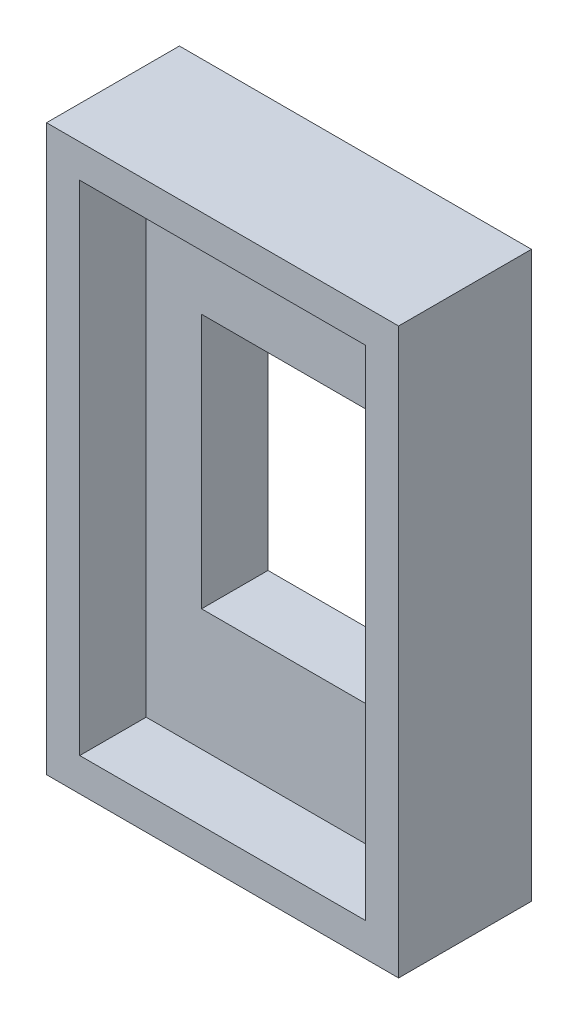
ISO-10303-21;
HEADER;
FILE_DESCRIPTION(('STEP AP214'),'2;1');
FILE_NAME('part.step','',(''),(''),'','','');
FILE_SCHEMA(('AUTOMOTIVE_DESIGN { 1 0 10303 214 1 1 1 1 }'));
ENDSEC;
DATA;
#1=APPLICATION_CONTEXT('core data for automotive mechanical design processes');
#2=APPLICATION_PROTOCOL_DEFINITION('international standard','automotive_design',2000,#1);
#3=PRODUCT_CONTEXT('',#1,'mechanical');
#4=PRODUCT('Part','Part','',(#3));
#5=PRODUCT_RELATED_PRODUCT_CATEGORY('part','',(#4));
#6=PRODUCT_DEFINITION_FORMATION('','',#4);
#7=PRODUCT_DEFINITION_CONTEXT('part definition',#1,'design');
#8=PRODUCT_DEFINITION('design','',#6,#7);
#9=PRODUCT_DEFINITION_SHAPE('','',#8);
#10=(LENGTH_UNIT() NAMED_UNIT(*) SI_UNIT(.MILLI.,.METRE.));
#11=(NAMED_UNIT(*) PLANE_ANGLE_UNIT() SI_UNIT($,.RADIAN.));
#12=(NAMED_UNIT(*) SI_UNIT($,.STERADIAN.) SOLID_ANGLE_UNIT());
#13=UNCERTAINTY_MEASURE_WITH_UNIT(LENGTH_MEASURE(1.E-05),#10,'distance_accuracy_value','');
#14=(GEOMETRIC_REPRESENTATION_CONTEXT(3) GLOBAL_UNCERTAINTY_ASSIGNED_CONTEXT((#13)) GLOBAL_UNIT_ASSIGNED_CONTEXT((#10,
#11,#12)) REPRESENTATION_CONTEXT('',''));
#15=CARTESIAN_POINT('',(0.,0.,0.));
#16=DIRECTION('',(0.,0.,1.));
#17=DIRECTION('',(1.,0.,0.));
#18=AXIS2_PLACEMENT_3D('',#15,#16,#17);
#19=CARTESIAN_POINT('',(-26.5,-42.5,20.));
#20=DIRECTION('',(1.,0.,0.));
#21=DIRECTION('',(0.,0.,-1.));
#22=AXIS2_PLACEMENT_3D('',#19,#20,#21);
#23=PLANE('',#22);
#24=DIRECTION('',(0.,-1.,0.));
#25=VECTOR('',#24,1.);
#26=CARTESIAN_POINT('',(-26.5,-42.5,0.));
#27=LINE('',#26,#25);
#28=CARTESIAN_POINT('',(-26.5,42.5,0.));
#29=VERTEX_POINT('',#28);
#30=CARTESIAN_POINT('',(-26.5,-42.5,0.));
#31=VERTEX_POINT('',#30);
#32=EDGE_CURVE('E183',#29,#31,#27,.T.);
#33=ORIENTED_EDGE('',*,*,#32,.T.);
#34=DIRECTION('',(0.,0.,-1.));
#35=VECTOR('',#34,1.);
#36=CARTESIAN_POINT('',(-26.5,-42.5,20.));
#37=LINE('',#36,#35);
#38=CARTESIAN_POINT('',(-26.5,-42.5,20.));
#39=VERTEX_POINT('',#38);
#40=EDGE_CURVE('E11',#39,#31,#37,.T.);
#41=ORIENTED_EDGE('',*,*,#40,.F.);
#42=DIRECTION('',(0.,-1.,0.));
#43=VECTOR('',#42,1.);
#44=CARTESIAN_POINT('',(-26.5,-42.5,20.));
#45=LINE('',#44,#43);
#46=CARTESIAN_POINT('',(-26.5,42.5,20.));
#47=VERTEX_POINT('',#46);
#48=EDGE_CURVE('E190',#47,#39,#45,.T.);
#49=ORIENTED_EDGE('',*,*,#48,.F.);
#50=DIRECTION('',(0.,0.,-1.));
#51=VECTOR('',#50,1.);
#52=CARTESIAN_POINT('',(-26.5,42.5,20.));
#53=LINE('',#52,#51);
#54=EDGE_CURVE('E200',#47,#29,#53,.T.);
#55=ORIENTED_EDGE('',*,*,#54,.T.);
#56=EDGE_LOOP('',(#33,#41,#49,#55));
#57=FACE_BOUND('',#56,.T.);
#58=ADVANCED_FACE('F33',(#57),#23,.F.);
#59=CARTESIAN_POINT('',(26.5,-42.5,20.));
#60=DIRECTION('',(0.,1.,0.));
#61=DIRECTION('',(-1.,0.,0.));
#62=AXIS2_PLACEMENT_3D('',#59,#60,#61);
#63=PLANE('',#62);
#64=DIRECTION('',(1.,0.,0.));
#65=VECTOR('',#64,1.);
#66=CARTESIAN_POINT('',(26.5,-42.5,0.));
#67=LINE('',#66,#65);
#68=CARTESIAN_POINT('',(26.5,-42.5,0.));
#69=VERTEX_POINT('',#68);
#70=EDGE_CURVE('E203',#31,#69,#67,.T.);
#71=ORIENTED_EDGE('',*,*,#70,.T.);
#72=DIRECTION('',(0.,0.,-1.));
#73=VECTOR('',#72,1.);
#74=CARTESIAN_POINT('',(26.5,-42.5,20.));
#75=LINE('',#74,#73);
#76=CARTESIAN_POINT('',(26.5,-42.5,20.));
#77=VERTEX_POINT('',#76);
#78=EDGE_CURVE('E40',#77,#69,#75,.T.);
#79=ORIENTED_EDGE('',*,*,#78,.F.);
#80=DIRECTION('',(1.,0.,0.));
#81=VECTOR('',#80,1.);
#82=CARTESIAN_POINT('',(26.5,-42.5,20.));
#83=LINE('',#82,#81);
#84=EDGE_CURVE('E193',#39,#77,#83,.T.);
#85=ORIENTED_EDGE('',*,*,#84,.F.);
#86=ORIENTED_EDGE('',*,*,#40,.T.);
#87=EDGE_LOOP('',(#71,#79,#85,#86));
#88=FACE_BOUND('',#87,.T.);
#89=ADVANCED_FACE('F233',(#88),#63,.F.);
#90=CARTESIAN_POINT('',(26.5,-42.5,20.));
#91=DIRECTION('',(-1.,0.,0.));
#92=DIRECTION('',(0.,0.,1.));
#93=AXIS2_PLACEMENT_3D('',#90,#91,#92);
#94=PLANE('',#93);
#95=DIRECTION('',(0.,1.,0.));
#96=VECTOR('',#95,1.);
#97=CARTESIAN_POINT('',(26.5,-42.5,0.));
#98=LINE('',#97,#96);
#99=CARTESIAN_POINT('',(26.5,42.5,0.));
#100=VERTEX_POINT('',#99);
#101=EDGE_CURVE('E205',#69,#100,#98,.T.);
#102=ORIENTED_EDGE('',*,*,#101,.T.);
#103=DIRECTION('',(0.,0.,-1.));
#104=VECTOR('',#103,1.);
#105=CARTESIAN_POINT('',(26.5,42.5,20.));
#106=LINE('',#105,#104);
#107=CARTESIAN_POINT('',(26.5,42.5,20.));
#108=VERTEX_POINT('',#107);
#109=EDGE_CURVE('E210',#108,#100,#106,.T.);
#110=ORIENTED_EDGE('',*,*,#109,.F.);
#111=DIRECTION('',(0.,1.,0.));
#112=VECTOR('',#111,1.);
#113=CARTESIAN_POINT('',(26.5,-42.5,20.));
#114=LINE('',#113,#112);
#115=EDGE_CURVE('E196',#77,#108,#114,.T.);
#116=ORIENTED_EDGE('',*,*,#115,.F.);
#117=ORIENTED_EDGE('',*,*,#78,.T.);
#118=EDGE_LOOP('',(#102,#110,#116,#117));
#119=FACE_BOUND('',#118,.T.);
#120=ADVANCED_FACE('F217',(#119),#94,.F.);
#121=CARTESIAN_POINT('',(26.5,42.5,20.));
#122=DIRECTION('',(0.,-1.,0.));
#123=DIRECTION('',(1.,0.,0.));
#124=AXIS2_PLACEMENT_3D('',#121,#122,#123);
#125=PLANE('',#124);
#126=DIRECTION('',(-1.,0.,0.));
#127=VECTOR('',#126,1.);
#128=CARTESIAN_POINT('',(26.5,42.5,0.));
#129=LINE('',#128,#127);
#130=EDGE_CURVE('E194',#100,#29,#129,.T.);
#131=ORIENTED_EDGE('',*,*,#130,.T.);
#132=ORIENTED_EDGE('',*,*,#54,.F.);
#133=DIRECTION('',(-1.,0.,0.));
#134=VECTOR('',#133,1.);
#135=CARTESIAN_POINT('',(26.5,42.5,20.));
#136=LINE('',#135,#134);
#137=EDGE_CURVE('E198',#108,#47,#136,.T.);
#138=ORIENTED_EDGE('',*,*,#137,.F.);
#139=ORIENTED_EDGE('',*,*,#109,.T.);
#140=EDGE_LOOP('',(#131,#132,#138,#139));
#141=FACE_BOUND('',#140,.T.);
#142=ADVANCED_FACE('F226',(#141),#125,.F.);
#143=CARTESIAN_POINT('',(0.,0.,20.));
#144=DIRECTION('',(0.,0.,1.));
#145=DIRECTION('',(1.,0.,0.));
#146=AXIS2_PLACEMENT_3D('',#143,#144,#145);
#147=PLANE('',#146);
#148=DIRECTION('',(0.,-1.,0.));
#149=VECTOR('',#148,1.);
#150=CARTESIAN_POINT('',(-21.5,-37.5,20.));
#151=LINE('',#150,#149);
#152=CARTESIAN_POINT('',(-21.5,37.5,20.));
#153=VERTEX_POINT('',#152);
#154=CARTESIAN_POINT('',(-21.5,-37.5,20.));
#155=VERTEX_POINT('',#154);
#156=EDGE_CURVE('E154',#153,#155,#151,.T.);
#157=ORIENTED_EDGE('',*,*,#156,.F.);
#158=DIRECTION('',(-1.,0.,0.));
#159=VECTOR('',#158,1.);
#160=CARTESIAN_POINT('',(21.5,37.5,20.));
#161=LINE('',#160,#159);
#162=CARTESIAN_POINT('',(21.5,37.5,20.));
#163=VERTEX_POINT('',#162);
#164=EDGE_CURVE('E162',#163,#153,#161,.T.);
#165=ORIENTED_EDGE('',*,*,#164,.F.);
#166=DIRECTION('',(0.,1.,0.));
#167=VECTOR('',#166,1.);
#168=CARTESIAN_POINT('',(21.5,-37.5,20.));
#169=LINE('',#168,#167);
#170=CARTESIAN_POINT('',(21.5,-37.5,20.));
#171=VERTEX_POINT('',#170);
#172=EDGE_CURVE('E176',#171,#163,#169,.T.);
#173=ORIENTED_EDGE('',*,*,#172,.F.);
#174=DIRECTION('',(1.,0.,0.));
#175=VECTOR('',#174,1.);
#176=CARTESIAN_POINT('',(21.5,-37.5,20.));
#177=LINE('',#176,#175);
#178=EDGE_CURVE('E173',#155,#171,#177,.T.);
#179=ORIENTED_EDGE('',*,*,#178,.F.);
#180=EDGE_LOOP('',(#157,#165,#173,#179));
#181=FACE_BOUND('',#180,.T.);
#182=ORIENTED_EDGE('',*,*,#48,.T.);
#183=ORIENTED_EDGE('',*,*,#84,.T.);
#184=ORIENTED_EDGE('',*,*,#115,.T.);
#185=ORIENTED_EDGE('',*,*,#137,.T.);
#186=EDGE_LOOP('',(#182,#183,#184,#185));
#187=FACE_BOUND('',#186,.T.);
#188=ADVANCED_FACE('F232',(#181,#187),#147,.T.);
#189=CARTESIAN_POINT('',(0.,0.,0.));
#190=DIRECTION('',(0.,0.,1.));
#191=DIRECTION('',(1.,0.,0.));
#192=AXIS2_PLACEMENT_3D('',#189,#190,#191);
#193=PLANE('',#192);
#194=DIRECTION('',(-1.,0.,0.));
#195=VECTOR('',#194,1.);
#196=CARTESIAN_POINT('',(-13.1607168812025,-19.1998278087766,0.));
#197=LINE('',#196,#195);
#198=CARTESIAN_POINT('',(13.1607168812025,-19.1998278087766,0.));
#199=VERTEX_POINT('',#198);
#200=CARTESIAN_POINT('',(-13.1607168812025,-19.1998278087766,0.));
#201=VERTEX_POINT('',#200);
#202=EDGE_CURVE('E148',#199,#201,#197,.T.);
#203=ORIENTED_EDGE('',*,*,#202,.F.);
#204=DIRECTION('',(0.,-1.,0.));
#205=VECTOR('',#204,1.);
#206=CARTESIAN_POINT('',(13.1607168812025,-19.1998278087766,0.));
#207=LINE('',#206,#205);
#208=CARTESIAN_POINT('',(13.1607168812025,19.1998278087766,0.));
#209=VERTEX_POINT('',#208);
#210=EDGE_CURVE('E47',#209,#199,#207,.T.);
#211=ORIENTED_EDGE('',*,*,#210,.F.);
#212=DIRECTION('',(1.,0.,0.));
#213=VECTOR('',#212,1.);
#214=CARTESIAN_POINT('',(-13.1607168812025,19.1998278087766,0.));
#215=LINE('',#214,#213);
#216=CARTESIAN_POINT('',(-13.1607168812025,19.1998278087766,0.));
#217=VERTEX_POINT('',#216);
#218=EDGE_CURVE('E139',#217,#209,#215,.T.);
#219=ORIENTED_EDGE('',*,*,#218,.F.);
#220=DIRECTION('',(0.,1.,0.));
#221=VECTOR('',#220,1.);
#222=CARTESIAN_POINT('',(-13.1607168812025,-19.1998278087766,0.));
#223=LINE('',#222,#221);
#224=EDGE_CURVE('E142',#201,#217,#223,.T.);
#225=ORIENTED_EDGE('',*,*,#224,.F.);
#226=EDGE_LOOP('',(#203,#211,#219,#225));
#227=FACE_BOUND('',#226,.T.);
#228=ORIENTED_EDGE('',*,*,#32,.F.);
#229=ORIENTED_EDGE('',*,*,#130,.F.);
#230=ORIENTED_EDGE('',*,*,#101,.F.);
#231=ORIENTED_EDGE('',*,*,#70,.F.);
#232=EDGE_LOOP('',(#228,#229,#230,#231));
#233=FACE_BOUND('',#232,.T.);
#234=ADVANCED_FACE('F223',(#227,#233),#193,.F.);
#235=CARTESIAN_POINT('',(-21.5,-37.5,10.));
#236=DIRECTION('',(-1.,0.,0.));
#237=DIRECTION('',(0.,0.,1.));
#238=AXIS2_PLACEMENT_3D('',#235,#236,#237);
#239=PLANE('',#238);
#240=ORIENTED_EDGE('',*,*,#156,.T.);
#241=DIRECTION('',(0.,0.,1.));
#242=VECTOR('',#241,1.);
#243=CARTESIAN_POINT('',(-21.5,-37.5,10.));
#244=LINE('',#243,#242);
#245=CARTESIAN_POINT('',(-21.5,-37.5,10.));
#246=VERTEX_POINT('',#245);
#247=EDGE_CURVE('E171',#246,#155,#244,.T.);
#248=ORIENTED_EDGE('',*,*,#247,.F.);
#249=DIRECTION('',(0.,-1.,0.));
#250=VECTOR('',#249,1.);
#251=CARTESIAN_POINT('',(-21.5,-37.5,10.));
#252=LINE('',#251,#250);
#253=CARTESIAN_POINT('',(-21.5,37.5,10.));
#254=VERTEX_POINT('',#253);
#255=EDGE_CURVE('E158',#254,#246,#252,.T.);
#256=ORIENTED_EDGE('',*,*,#255,.F.);
#257=DIRECTION('',(0.,0.,1.));
#258=VECTOR('',#257,1.);
#259=CARTESIAN_POINT('',(-21.5,37.5,10.));
#260=LINE('',#259,#258);
#261=EDGE_CURVE('E181',#254,#153,#260,.T.);
#262=ORIENTED_EDGE('',*,*,#261,.T.);
#263=EDGE_LOOP('',(#240,#248,#256,#262));
#264=FACE_BOUND('',#263,.T.);
#265=ADVANCED_FACE('F245',(#264),#239,.F.);
#266=CARTESIAN_POINT('',(21.5,37.5,10.));
#267=DIRECTION('',(0.,1.,0.));
#268=DIRECTION('',(0.,0.,1.));
#269=AXIS2_PLACEMENT_3D('',#266,#267,#268);
#270=PLANE('',#269);
#271=ORIENTED_EDGE('',*,*,#164,.T.);
#272=ORIENTED_EDGE('',*,*,#261,.F.);
#273=DIRECTION('',(-1.,0.,0.));
#274=VECTOR('',#273,1.);
#275=CARTESIAN_POINT('',(21.5,37.5,10.));
#276=LINE('',#275,#274);
#277=CARTESIAN_POINT('',(21.5,37.5,10.));
#278=VERTEX_POINT('',#277);
#279=EDGE_CURVE('E168',#278,#254,#276,.T.);
#280=ORIENTED_EDGE('',*,*,#279,.F.);
#281=DIRECTION('',(0.,0.,1.));
#282=VECTOR('',#281,1.);
#283=CARTESIAN_POINT('',(21.5,37.5,10.));
#284=LINE('',#283,#282);
#285=EDGE_CURVE('E184',#278,#163,#284,.T.);
#286=ORIENTED_EDGE('',*,*,#285,.T.);
#287=EDGE_LOOP('',(#271,#272,#280,#286));
#288=FACE_BOUND('',#287,.T.);
#289=ADVANCED_FACE('F252',(#288),#270,.F.);
#290=CARTESIAN_POINT('',(21.5,-37.5,10.));
#291=DIRECTION('',(1.,0.,0.));
#292=DIRECTION('',(0.,0.,-1.));
#293=AXIS2_PLACEMENT_3D('',#290,#291,#292);
#294=PLANE('',#293);
#295=ORIENTED_EDGE('',*,*,#172,.T.);
#296=ORIENTED_EDGE('',*,*,#285,.F.);
#297=DIRECTION('',(0.,1.,0.));
#298=VECTOR('',#297,1.);
#299=CARTESIAN_POINT('',(21.5,-37.5,10.));
#300=LINE('',#299,#298);
#301=CARTESIAN_POINT('',(21.5,-37.5,10.));
#302=VERTEX_POINT('',#301);
#303=EDGE_CURVE('E165',#302,#278,#300,.T.);
#304=ORIENTED_EDGE('',*,*,#303,.F.);
#305=DIRECTION('',(0.,0.,1.));
#306=VECTOR('',#305,1.);
#307=CARTESIAN_POINT('',(21.5,-37.5,10.));
#308=LINE('',#307,#306);
#309=EDGE_CURVE('E186',#302,#171,#308,.T.);
#310=ORIENTED_EDGE('',*,*,#309,.T.);
#311=EDGE_LOOP('',(#295,#296,#304,#310));
#312=FACE_BOUND('',#311,.T.);
#313=ADVANCED_FACE('F257',(#312),#294,.F.);
#314=CARTESIAN_POINT('',(21.5,-37.5,10.));
#315=DIRECTION('',(0.,-1.,0.));
#316=DIRECTION('',(0.,0.,-1.));
#317=AXIS2_PLACEMENT_3D('',#314,#315,#316);
#318=PLANE('',#317);
#319=ORIENTED_EDGE('',*,*,#178,.T.);
#320=ORIENTED_EDGE('',*,*,#309,.F.);
#321=DIRECTION('',(1.,0.,0.));
#322=VECTOR('',#321,1.);
#323=CARTESIAN_POINT('',(21.5,-37.5,10.));
#324=LINE('',#323,#322);
#325=EDGE_CURVE('E161',#246,#302,#324,.T.);
#326=ORIENTED_EDGE('',*,*,#325,.F.);
#327=ORIENTED_EDGE('',*,*,#247,.T.);
#328=EDGE_LOOP('',(#319,#320,#326,#327));
#329=FACE_BOUND('',#328,.T.);
#330=ADVANCED_FACE('F254',(#329),#318,.F.);
#331=CARTESIAN_POINT('',(0.,0.,10.));
#332=DIRECTION('',(0.,0.,1.));
#333=DIRECTION('',(1.,0.,0.));
#334=AXIS2_PLACEMENT_3D('',#331,#332,#333);
#335=PLANE('',#334);
#336=DIRECTION('',(0.,-1.,0.));
#337=VECTOR('',#336,1.);
#338=CARTESIAN_POINT('',(13.1607168812025,-19.1998278087766,10.));
#339=LINE('',#338,#337);
#340=CARTESIAN_POINT('',(13.1607168812025,19.1998278087766,10.));
#341=VERTEX_POINT('',#340);
#342=CARTESIAN_POINT('',(13.1607168812025,-19.1998278087766,10.));
#343=VERTEX_POINT('',#342);
#344=EDGE_CURVE('E123',#341,#343,#339,.T.);
#345=ORIENTED_EDGE('',*,*,#344,.T.);
#346=DIRECTION('',(-1.,0.,0.));
#347=VECTOR('',#346,1.);
#348=CARTESIAN_POINT('',(-13.1607168812025,-19.1998278087766,10.));
#349=LINE('',#348,#347);
#350=CARTESIAN_POINT('',(-13.1607168812025,-19.1998278087766,10.));
#351=VERTEX_POINT('',#350);
#352=EDGE_CURVE('E132',#343,#351,#349,.T.);
#353=ORIENTED_EDGE('',*,*,#352,.T.);
#354=DIRECTION('',(0.,1.,0.));
#355=VECTOR('',#354,1.);
#356=CARTESIAN_POINT('',(-13.1607168812025,-19.1998278087766,10.));
#357=LINE('',#356,#355);
#358=CARTESIAN_POINT('',(-13.1607168812025,19.1998278087766,10.));
#359=VERTEX_POINT('',#358);
#360=EDGE_CURVE('E55',#351,#359,#357,.T.);
#361=ORIENTED_EDGE('',*,*,#360,.T.);
#362=DIRECTION('',(1.,0.,0.));
#363=VECTOR('',#362,1.);
#364=CARTESIAN_POINT('',(-13.1607168812025,19.1998278087766,10.));
#365=LINE('',#364,#363);
#366=EDGE_CURVE('E129',#359,#341,#365,.T.);
#367=ORIENTED_EDGE('',*,*,#366,.T.);
#368=EDGE_LOOP('',(#345,#353,#361,#367));
#369=FACE_BOUND('',#368,.T.);
#370=ORIENTED_EDGE('',*,*,#255,.T.);
#371=ORIENTED_EDGE('',*,*,#325,.T.);
#372=ORIENTED_EDGE('',*,*,#303,.T.);
#373=ORIENTED_EDGE('',*,*,#279,.T.);
#374=EDGE_LOOP('',(#370,#371,#372,#373));
#375=FACE_BOUND('',#374,.T.);
#376=ADVANCED_FACE('F136',(#369,#375),#335,.T.);
#377=CARTESIAN_POINT('',(13.1607168812025,-19.1998278087766,10.));
#378=DIRECTION('',(1.,0.,0.));
#379=DIRECTION('',(0.,0.,-1.));
#380=AXIS2_PLACEMENT_3D('',#377,#378,#379);
#381=PLANE('',#380);
#382=ORIENTED_EDGE('',*,*,#210,.T.);
#383=DIRECTION('',(0.,0.,-1.));
#384=VECTOR('',#383,1.);
#385=CARTESIAN_POINT('',(13.1607168812025,-19.1998278087766,10.));
#386=LINE('',#385,#384);
#387=EDGE_CURVE('E119',#343,#199,#386,.T.);
#388=ORIENTED_EDGE('',*,*,#387,.F.);
#389=ORIENTED_EDGE('',*,*,#344,.F.);
#390=DIRECTION('',(0.,0.,-1.));
#391=VECTOR('',#390,1.);
#392=CARTESIAN_POINT('',(13.1607168812025,19.1998278087766,10.));
#393=LINE('',#392,#391);
#394=EDGE_CURVE('E152',#341,#209,#393,.T.);
#395=ORIENTED_EDGE('',*,*,#394,.T.);
#396=EDGE_LOOP('',(#382,#388,#389,#395));
#397=FACE_BOUND('',#396,.T.);
#398=ADVANCED_FACE('F121',(#397),#381,.F.);
#399=CARTESIAN_POINT('',(-13.1607168812025,19.1998278087766,10.));
#400=DIRECTION('',(0.,1.,0.));
#401=DIRECTION('',(0.,0.,1.));
#402=AXIS2_PLACEMENT_3D('',#399,#400,#401);
#403=PLANE('',#402);
#404=ORIENTED_EDGE('',*,*,#218,.T.);
#405=ORIENTED_EDGE('',*,*,#394,.F.);
#406=ORIENTED_EDGE('',*,*,#366,.F.);
#407=DIRECTION('',(0.,0.,-1.));
#408=VECTOR('',#407,1.);
#409=CARTESIAN_POINT('',(-13.1607168812025,19.1998278087766,10.));
#410=LINE('',#409,#408);
#411=EDGE_CURVE('E155',#359,#217,#410,.T.);
#412=ORIENTED_EDGE('',*,*,#411,.T.);
#413=EDGE_LOOP('',(#404,#405,#406,#412));
#414=FACE_BOUND('',#413,.T.);
#415=ADVANCED_FACE('F269',(#414),#403,.F.);
#416=CARTESIAN_POINT('',(-13.1607168812025,-19.1998278087766,10.));
#417=DIRECTION('',(-1.,0.,0.));
#418=DIRECTION('',(0.,0.,1.));
#419=AXIS2_PLACEMENT_3D('',#416,#417,#418);
#420=PLANE('',#419);
#421=ORIENTED_EDGE('',*,*,#224,.T.);
#422=ORIENTED_EDGE('',*,*,#411,.F.);
#423=ORIENTED_EDGE('',*,*,#360,.F.);
#424=DIRECTION('',(0.,0.,-1.));
#425=VECTOR('',#424,1.);
#426=CARTESIAN_POINT('',(-13.1607168812025,-19.1998278087766,10.));
#427=LINE('',#426,#425);
#428=EDGE_CURVE('E128',#351,#201,#427,.T.);
#429=ORIENTED_EDGE('',*,*,#428,.T.);
#430=EDGE_LOOP('',(#421,#422,#423,#429));
#431=FACE_BOUND('',#430,.T.);
#432=ADVANCED_FACE('F272',(#431),#420,.F.);
#433=CARTESIAN_POINT('',(-13.1607168812025,-19.1998278087766,10.));
#434=DIRECTION('',(0.,-1.,0.));
#435=DIRECTION('',(0.,0.,-1.));
#436=AXIS2_PLACEMENT_3D('',#433,#434,#435);
#437=PLANE('',#436);
#438=ORIENTED_EDGE('',*,*,#202,.T.);
#439=ORIENTED_EDGE('',*,*,#428,.F.);
#440=ORIENTED_EDGE('',*,*,#352,.F.);
#441=ORIENTED_EDGE('',*,*,#387,.T.);
#442=EDGE_LOOP('',(#438,#439,#440,#441));
#443=FACE_BOUND('',#442,.T.);
#444=ADVANCED_FACE('F133',(#443),#437,.F.);
#445=CLOSED_SHELL('',(#58,#89,#120,#142,#188,#234,#265,#289,#313,#330,#376,#398,#415,#432,#444));
#446=MANIFOLD_SOLID_BREP('B2',#445);
#447=ADVANCED_BREP_SHAPE_REPRESENTATION('',(#18,#446),#14);
#448=SHAPE_DEFINITION_REPRESENTATION(#9,#447);
ENDSEC;
END-ISO-10303-21;
